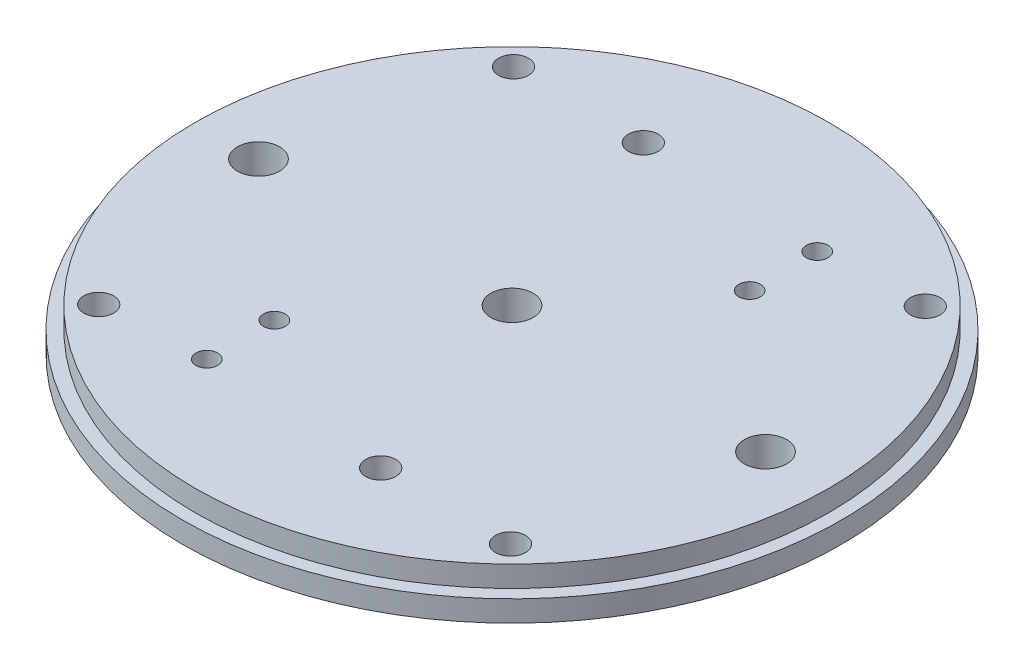
ISO-10303-21;
HEADER;
FILE_DESCRIPTION(('STEP AP214'),'2;1');
FILE_NAME('part.step','',(''),(''),'','','');
FILE_SCHEMA(('AUTOMOTIVE_DESIGN { 1 0 10303 214 1 1 1 1 }'));
ENDSEC;
DATA;
#1=APPLICATION_CONTEXT('core data for automotive mechanical design processes');
#2=APPLICATION_PROTOCOL_DEFINITION('international standard','automotive_design',2000,#1);
#3=PRODUCT_CONTEXT('',#1,'mechanical');
#4=PRODUCT('Part','Part','',(#3));
#5=PRODUCT_RELATED_PRODUCT_CATEGORY('part','',(#4));
#6=PRODUCT_DEFINITION_FORMATION('','',#4);
#7=PRODUCT_DEFINITION_CONTEXT('part definition',#1,'design');
#8=PRODUCT_DEFINITION('design','',#6,#7);
#9=PRODUCT_DEFINITION_SHAPE('','',#8);
#10=(LENGTH_UNIT() NAMED_UNIT(*) SI_UNIT(.MILLI.,.METRE.));
#11=(NAMED_UNIT(*) PLANE_ANGLE_UNIT() SI_UNIT($,.RADIAN.));
#12=(NAMED_UNIT(*) SI_UNIT($,.STERADIAN.) SOLID_ANGLE_UNIT());
#13=UNCERTAINTY_MEASURE_WITH_UNIT(LENGTH_MEASURE(1.E-05),#10,'distance_accuracy_value','');
#14=(GEOMETRIC_REPRESENTATION_CONTEXT(3) GLOBAL_UNCERTAINTY_ASSIGNED_CONTEXT((#13)) GLOBAL_UNIT_ASSIGNED_CONTEXT((#10,
#11,#12)) REPRESENTATION_CONTEXT('',''));
#15=CARTESIAN_POINT('',(0.,0.,0.));
#16=DIRECTION('',(0.,0.,1.));
#17=DIRECTION('',(1.,0.,0.));
#18=AXIS2_PLACEMENT_3D('',#15,#16,#17);
#19=CARTESIAN_POINT('',(0.,6.35,0.));
#20=DIRECTION('',(0.,1.,0.));
#21=DIRECTION('',(0.,0.,1.));
#22=AXIS2_PLACEMENT_3D('',#19,#20,#21);
#23=PLANE('',#22);
#24=CARTESIAN_POINT('',(0.,6.35,0.));
#25=DIRECTION('',(0.,1.,0.));
#26=DIRECTION('',(0.,0.,1.));
#27=AXIS2_PLACEMENT_3D('',#24,#25,#26);
#28=CIRCLE('',#27,47.625);
#29=CARTESIAN_POINT('',(0.,6.35,47.625));
#30=VERTEX_POINT('',#29);
#31=EDGE_CURVE('E42',#30,#30,#28,.T.);
#32=ORIENTED_EDGE('',*,*,#31,.T.);
#33=EDGE_LOOP('',(#32));
#34=FACE_BOUND('',#33,.T.);
#35=CARTESIAN_POINT('',(-38.1,6.35,0.));
#36=DIRECTION('',(0.,1.,0.));
#37=DIRECTION('',(0.,0.,1.));
#38=AXIS2_PLACEMENT_3D('',#35,#36,#37);
#39=CIRCLE('',#38,3.175);
#40=CARTESIAN_POINT('',(-38.1,6.35,3.175));
#41=VERTEX_POINT('',#40);
#42=EDGE_CURVE('E50',#41,#41,#39,.T.);
#43=ORIENTED_EDGE('',*,*,#42,.F.);
#44=EDGE_LOOP('',(#43));
#45=FACE_BOUND('',#44,.T.);
#46=CARTESIAN_POINT('',(38.1,6.35,0.));
#47=DIRECTION('',(0.,1.,0.));
#48=DIRECTION('',(0.,0.,1.));
#49=AXIS2_PLACEMENT_3D('',#46,#47,#48);
#50=CIRCLE('',#49,3.175);
#51=CARTESIAN_POINT('',(38.1,6.35,3.175));
#52=VERTEX_POINT('',#51);
#53=EDGE_CURVE('E56',#52,#52,#50,.T.);
#54=ORIENTED_EDGE('',*,*,#53,.F.);
#55=EDGE_LOOP('',(#54));
#56=FACE_BOUND('',#55,.T.);
#57=CARTESIAN_POINT('',(0.,6.35,0.));
#58=DIRECTION('',(0.,1.,0.));
#59=DIRECTION('',(0.,0.,1.));
#60=AXIS2_PLACEMENT_3D('',#57,#58,#59);
#61=CIRCLE('',#60,3.175);
#62=CARTESIAN_POINT('',(0.,6.35,3.175));
#63=VERTEX_POINT('',#62);
#64=EDGE_CURVE('E62',#63,#63,#61,.T.);
#65=ORIENTED_EDGE('',*,*,#64,.F.);
#66=EDGE_LOOP('',(#65));
#67=FACE_BOUND('',#66,.T.);
#68=CARTESIAN_POINT('',(-31.1697748135231,6.35,30.940594365611));
#69=DIRECTION('',(0.,-1.,0.));
#70=DIRECTION('',(0.,0.,-1.));
#71=AXIS2_PLACEMENT_3D('',#68,#69,#70);
#72=CIRCLE('',#71,2.2479);
#73=CARTESIAN_POINT('',(-31.1697748135231,6.35,28.692694365611));
#74=VERTEX_POINT('',#73);
#75=EDGE_CURVE('E65',#74,#74,#72,.T.);
#76=ORIENTED_EDGE('',*,*,#75,.T.);
#77=EDGE_LOOP('',(#76));
#78=FACE_BOUND('',#77,.T.);
#79=CARTESIAN_POINT('',(30.9405943656111,6.35,31.169774813523));
#80=DIRECTION('',(0.,-1.,0.));
#81=DIRECTION('',(0.,0.,-1.));
#82=AXIS2_PLACEMENT_3D('',#79,#80,#81);
#83=CIRCLE('',#82,2.24789999999999);
#84=CARTESIAN_POINT('',(30.9405943656111,6.35,28.921874813523));
#85=VERTEX_POINT('',#84);
#86=EDGE_CURVE('E76',#85,#85,#83,.T.);
#87=ORIENTED_EDGE('',*,*,#86,.T.);
#88=EDGE_LOOP('',(#87));
#89=FACE_BOUND('',#88,.T.);
#90=CARTESIAN_POINT('',(31.1697748135231,6.35,-30.940594365611));
#91=DIRECTION('',(0.,-1.,0.));
#92=DIRECTION('',(0.,0.,-1.));
#93=AXIS2_PLACEMENT_3D('',#90,#91,#92);
#94=CIRCLE('',#93,2.2479);
#95=CARTESIAN_POINT('',(31.1697748135231,6.35,-33.188494365611));
#96=VERTEX_POINT('',#95);
#97=EDGE_CURVE('E85',#96,#96,#94,.T.);
#98=ORIENTED_EDGE('',*,*,#97,.T.);
#99=EDGE_LOOP('',(#98));
#100=FACE_BOUND('',#99,.T.);
#101=CARTESIAN_POINT('',(-30.9405943656113,6.35,-31.1697748135227));
#102=DIRECTION('',(0.,-1.,0.));
#103=DIRECTION('',(0.,0.,-1.));
#104=AXIS2_PLACEMENT_3D('',#101,#102,#103);
#105=CIRCLE('',#104,2.2479);
#106=CARTESIAN_POINT('',(-30.9405943656113,6.35,-33.4176748135227));
#107=VERTEX_POINT('',#106);
#108=EDGE_CURVE('E94',#107,#107,#105,.T.);
#109=ORIENTED_EDGE('',*,*,#108,.T.);
#110=EDGE_LOOP('',(#109));
#111=FACE_BOUND('',#110,.T.);
#112=CARTESIAN_POINT('',(11.2935051326137,6.35,31.0286503383506));
#113=DIRECTION('',(0.,-1.,0.));
#114=DIRECTION('',(0.,0.,-1.));
#115=AXIS2_PLACEMENT_3D('',#112,#113,#114);
#116=CIRCLE('',#115,2.2479);
#117=CARTESIAN_POINT('',(11.2935051326137,6.35,28.7807503383506));
#118=VERTEX_POINT('',#117);
#119=EDGE_CURVE('E103',#118,#118,#116,.T.);
#120=ORIENTED_EDGE('',*,*,#119,.T.);
#121=EDGE_LOOP('',(#120));
#122=FACE_BOUND('',#121,.T.);
#123=CARTESIAN_POINT('',(-11.2935051326137,6.35,-31.0286503383507));
#124=DIRECTION('',(0.,-1.,0.));
#125=DIRECTION('',(0.,0.,-1.));
#126=AXIS2_PLACEMENT_3D('',#123,#124,#125);
#127=CIRCLE('',#126,2.2479);
#128=CARTESIAN_POINT('',(-11.2935051326137,6.35,-33.2765503383507));
#129=VERTEX_POINT('',#128);
#130=EDGE_CURVE('E109',#129,#129,#127,.T.);
#131=ORIENTED_EDGE('',*,*,#130,.T.);
#132=EDGE_LOOP('',(#131));
#133=FACE_BOUND('',#132,.T.);
#134=CARTESIAN_POINT('',(-15.9297748135231,6.34999999999999,29.9438892635004));
#135=DIRECTION('',(0.,-1.,0.));
#136=DIRECTION('',(0.,0.,-1.));
#137=AXIS2_PLACEMENT_3D('',#134,#135,#136);
#138=CIRCLE('',#137,1.63194999999999);
#139=CARTESIAN_POINT('',(-15.9297748135231,6.34999999999999,28.3119392635004));
#140=VERTEX_POINT('',#139);
#141=EDGE_CURVE('E115',#140,#140,#138,.T.);
#142=ORIENTED_EDGE('',*,*,#141,.T.);
#143=EDGE_LOOP('',(#142));
#144=FACE_BOUND('',#143,.T.);
#145=CARTESIAN_POINT('',(15.9297748135231,6.34999999999999,-29.9438892635004));
#146=DIRECTION('',(0.,-1.,0.));
#147=DIRECTION('',(0.,0.,-1.));
#148=AXIS2_PLACEMENT_3D('',#145,#146,#147);
#149=CIRCLE('',#148,1.63194999999999);
#150=CARTESIAN_POINT('',(15.9297748135231,6.34999999999999,-31.5758392635004));
#151=VERTEX_POINT('',#150);
#152=EDGE_CURVE('E121',#151,#151,#149,.T.);
#153=ORIENTED_EDGE('',*,*,#152,.T.);
#154=EDGE_LOOP('',(#153));
#155=FACE_BOUND('',#154,.T.);
#156=CARTESIAN_POINT('',(-15.9297748135231,6.34999999999999,19.7838892635004));
#157=DIRECTION('',(0.,-1.,0.));
#158=DIRECTION('',(0.,0.,-1.));
#159=AXIS2_PLACEMENT_3D('',#156,#157,#158);
#160=CIRCLE('',#159,1.63194999999999);
#161=CARTESIAN_POINT('',(-15.9297748135231,6.34999999999999,18.1519392635004));
#162=VERTEX_POINT('',#161);
#163=EDGE_CURVE('E127',#162,#162,#160,.T.);
#164=ORIENTED_EDGE('',*,*,#163,.T.);
#165=EDGE_LOOP('',(#164));
#166=FACE_BOUND('',#165,.T.);
#167=CARTESIAN_POINT('',(15.9297748135231,6.34999999999999,-19.7838892635004));
#168=DIRECTION('',(0.,-1.,0.));
#169=DIRECTION('',(0.,0.,-1.));
#170=AXIS2_PLACEMENT_3D('',#167,#168,#169);
#171=CIRCLE('',#170,1.63194999999999);
#172=CARTESIAN_POINT('',(15.9297748135231,6.34999999999999,-21.4158392635004));
#173=VERTEX_POINT('',#172);
#174=EDGE_CURVE('E133',#173,#173,#171,.T.);
#175=ORIENTED_EDGE('',*,*,#174,.T.);
#176=EDGE_LOOP('',(#175));
#177=FACE_BOUND('',#176,.T.);
#178=ADVANCED_FACE('F31',(#34,#45,#56,#67,#78,#89,#100,#111,#122,#133,#144,#155,#166,#177),#23,.T.);
#179=CARTESIAN_POINT('',(0.,0.,0.));
#180=DIRECTION('',(0.,1.,0.));
#181=DIRECTION('',(0.,0.,1.));
#182=AXIS2_PLACEMENT_3D('',#179,#180,#181);
#183=PLANE('',#182);
#184=CARTESIAN_POINT('',(15.9297748135231,0.,-19.7838892635004));
#185=DIRECTION('',(0.,-1.,0.));
#186=DIRECTION('',(0.,0.,-1.));
#187=AXIS2_PLACEMENT_3D('',#184,#185,#186);
#188=CIRCLE('',#187,1.63194999999999);
#189=CARTESIAN_POINT('',(15.9297748135231,0.,-21.4158392635004));
#190=VERTEX_POINT('',#189);
#191=EDGE_CURVE('E136',#190,#190,#188,.T.);
#192=ORIENTED_EDGE('',*,*,#191,.F.);
#193=EDGE_LOOP('',(#192));
#194=FACE_BOUND('',#193,.T.);
#195=CARTESIAN_POINT('',(-15.9297748135231,0.,19.7838892635004));
#196=DIRECTION('',(0.,-1.,0.));
#197=DIRECTION('',(0.,0.,-1.));
#198=AXIS2_PLACEMENT_3D('',#195,#196,#197);
#199=CIRCLE('',#198,1.63194999999999);
#200=CARTESIAN_POINT('',(-15.9297748135231,0.,18.1519392635004));
#201=VERTEX_POINT('',#200);
#202=EDGE_CURVE('E130',#201,#201,#199,.T.);
#203=ORIENTED_EDGE('',*,*,#202,.F.);
#204=EDGE_LOOP('',(#203));
#205=FACE_BOUND('',#204,.T.);
#206=CARTESIAN_POINT('',(15.9297748135231,0.,-29.9438892635004));
#207=DIRECTION('',(0.,-1.,0.));
#208=DIRECTION('',(0.,0.,-1.));
#209=AXIS2_PLACEMENT_3D('',#206,#207,#208);
#210=CIRCLE('',#209,1.63194999999999);
#211=CARTESIAN_POINT('',(15.9297748135231,0.,-31.5758392635004));
#212=VERTEX_POINT('',#211);
#213=EDGE_CURVE('E124',#212,#212,#210,.T.);
#214=ORIENTED_EDGE('',*,*,#213,.F.);
#215=EDGE_LOOP('',(#214));
#216=FACE_BOUND('',#215,.T.);
#217=CARTESIAN_POINT('',(-15.9297748135231,0.,29.9438892635004));
#218=DIRECTION('',(0.,-1.,0.));
#219=DIRECTION('',(0.,0.,-1.));
#220=AXIS2_PLACEMENT_3D('',#217,#218,#219);
#221=CIRCLE('',#220,1.63194999999999);
#222=CARTESIAN_POINT('',(-15.9297748135231,0.,28.3119392635004));
#223=VERTEX_POINT('',#222);
#224=EDGE_CURVE('E118',#223,#223,#221,.T.);
#225=ORIENTED_EDGE('',*,*,#224,.F.);
#226=EDGE_LOOP('',(#225));
#227=FACE_BOUND('',#226,.T.);
#228=CARTESIAN_POINT('',(-30.9405943656113,0.,-31.1697748135227));
#229=DIRECTION('',(0.,-1.,0.));
#230=DIRECTION('',(0.,0.,-1.));
#231=AXIS2_PLACEMENT_3D('',#228,#229,#230);
#232=CIRCLE('',#231,4.2164);
#233=CARTESIAN_POINT('',(-30.9405943656113,0.,-35.3861748135228));
#234=VERTEX_POINT('',#233);
#235=EDGE_CURVE('E100',#234,#234,#232,.T.);
#236=ORIENTED_EDGE('',*,*,#235,.F.);
#237=EDGE_LOOP('',(#236));
#238=FACE_BOUND('',#237,.T.);
#239=CARTESIAN_POINT('',(31.1697748135231,0.,-30.940594365611));
#240=DIRECTION('',(0.,-1.,0.));
#241=DIRECTION('',(0.,0.,-1.));
#242=AXIS2_PLACEMENT_3D('',#239,#240,#241);
#243=CIRCLE('',#242,4.2164);
#244=CARTESIAN_POINT('',(31.1697748135231,0.,-35.156994365611));
#245=VERTEX_POINT('',#244);
#246=EDGE_CURVE('E91',#245,#245,#243,.T.);
#247=ORIENTED_EDGE('',*,*,#246,.F.);
#248=EDGE_LOOP('',(#247));
#249=FACE_BOUND('',#248,.T.);
#250=CARTESIAN_POINT('',(30.9405943656111,0.,31.169774813523));
#251=DIRECTION('',(0.,-1.,0.));
#252=DIRECTION('',(0.,0.,-1.));
#253=AXIS2_PLACEMENT_3D('',#250,#251,#252);
#254=CIRCLE('',#253,4.2164);
#255=CARTESIAN_POINT('',(30.9405943656111,0.,26.953374813523));
#256=VERTEX_POINT('',#255);
#257=EDGE_CURVE('E82',#256,#256,#254,.T.);
#258=ORIENTED_EDGE('',*,*,#257,.F.);
#259=EDGE_LOOP('',(#258));
#260=FACE_BOUND('',#259,.T.);
#261=CARTESIAN_POINT('',(-31.1697748135231,0.,30.940594365611));
#262=DIRECTION('',(0.,-1.,0.));
#263=DIRECTION('',(0.,0.,-1.));
#264=AXIS2_PLACEMENT_3D('',#261,#262,#263);
#265=CIRCLE('',#264,4.2164);
#266=CARTESIAN_POINT('',(-31.1697748135231,0.,26.724194365611));
#267=VERTEX_POINT('',#266);
#268=EDGE_CURVE('E73',#267,#267,#265,.T.);
#269=ORIENTED_EDGE('',*,*,#268,.F.);
#270=EDGE_LOOP('',(#269));
#271=FACE_BOUND('',#270,.T.);
#272=CARTESIAN_POINT('',(0.,0.,0.));
#273=DIRECTION('',(0.,1.,0.));
#274=DIRECTION('',(0.,0.,1.));
#275=AXIS2_PLACEMENT_3D('',#272,#273,#274);
#276=CIRCLE('',#275,3.175);
#277=CARTESIAN_POINT('',(0.,0.,3.175));
#278=VERTEX_POINT('',#277);
#279=EDGE_CURVE('E59',#278,#278,#276,.T.);
#280=ORIENTED_EDGE('',*,*,#279,.T.);
#281=EDGE_LOOP('',(#280));
#282=FACE_BOUND('',#281,.T.);
#283=CARTESIAN_POINT('',(38.1,0.,0.));
#284=DIRECTION('',(0.,1.,0.));
#285=DIRECTION('',(0.,0.,1.));
#286=AXIS2_PLACEMENT_3D('',#283,#284,#285);
#287=CIRCLE('',#286,3.175);
#288=CARTESIAN_POINT('',(38.1,0.,3.175));
#289=VERTEX_POINT('',#288);
#290=EDGE_CURVE('E53',#289,#289,#287,.T.);
#291=ORIENTED_EDGE('',*,*,#290,.T.);
#292=EDGE_LOOP('',(#291));
#293=FACE_BOUND('',#292,.T.);
#294=CARTESIAN_POINT('',(-38.1,0.,0.));
#295=DIRECTION('',(0.,1.,0.));
#296=DIRECTION('',(0.,0.,1.));
#297=AXIS2_PLACEMENT_3D('',#294,#295,#296);
#298=CIRCLE('',#297,3.175);
#299=CARTESIAN_POINT('',(-38.1,0.,3.175));
#300=VERTEX_POINT('',#299);
#301=EDGE_CURVE('E47',#300,#300,#298,.T.);
#302=ORIENTED_EDGE('',*,*,#301,.T.);
#303=EDGE_LOOP('',(#302));
#304=FACE_BOUND('',#303,.T.);
#305=CARTESIAN_POINT('',(0.,0.,0.));
#306=DIRECTION('',(0.,1.,0.));
#307=DIRECTION('',(0.,0.,1.));
#308=AXIS2_PLACEMENT_3D('',#305,#306,#307);
#309=CIRCLE('',#308,49.53);
#310=CARTESIAN_POINT('',(0.,0.,49.53));
#311=VERTEX_POINT('',#310);
#312=EDGE_CURVE('E35',#311,#311,#309,.T.);
#313=ORIENTED_EDGE('',*,*,#312,.F.);
#314=EDGE_LOOP('',(#313));
#315=FACE_BOUND('',#314,.T.);
#316=CARTESIAN_POINT('',(11.2935051326137,0.,31.0286503383506));
#317=DIRECTION('',(0.,-1.,0.));
#318=DIRECTION('',(0.,0.,-1.));
#319=AXIS2_PLACEMENT_3D('',#316,#317,#318);
#320=CIRCLE('',#319,2.2479);
#321=CARTESIAN_POINT('',(11.2935051326137,0.,28.7807503383506));
#322=VERTEX_POINT('',#321);
#323=EDGE_CURVE('E106',#322,#322,#320,.T.);
#324=ORIENTED_EDGE('',*,*,#323,.F.);
#325=EDGE_LOOP('',(#324));
#326=FACE_BOUND('',#325,.T.);
#327=CARTESIAN_POINT('',(-11.2935051326137,0.,-31.0286503383507));
#328=DIRECTION('',(0.,-1.,0.));
#329=DIRECTION('',(0.,0.,-1.));
#330=AXIS2_PLACEMENT_3D('',#327,#328,#329);
#331=CIRCLE('',#330,2.2479);
#332=CARTESIAN_POINT('',(-11.2935051326137,0.,-33.2765503383507));
#333=VERTEX_POINT('',#332);
#334=EDGE_CURVE('E112',#333,#333,#331,.T.);
#335=ORIENTED_EDGE('',*,*,#334,.F.);
#336=EDGE_LOOP('',(#335));
#337=FACE_BOUND('',#336,.T.);
#338=ADVANCED_FACE('F142',(#194,#205,#216,#227,#238,#249,#260,#271,#282,#293,#304,#315,#326,
#337),#183,.F.);
#339=CARTESIAN_POINT('',(0.,3.175,0.));
#340=DIRECTION('',(0.,1.,0.));
#341=DIRECTION('',(0.,0.,1.));
#342=AXIS2_PLACEMENT_3D('',#339,#340,#341);
#343=PLANE('',#342);
#344=CARTESIAN_POINT('',(0.,3.175,0.));
#345=DIRECTION('',(0.,1.,0.));
#346=DIRECTION('',(0.,0.,1.));
#347=AXIS2_PLACEMENT_3D('',#344,#345,#346);
#348=CIRCLE('',#347,49.53);
#349=CARTESIAN_POINT('',(0.,3.175,49.53));
#350=VERTEX_POINT('',#349);
#351=EDGE_CURVE('E10',#350,#350,#348,.T.);
#352=ORIENTED_EDGE('',*,*,#351,.T.);
#353=EDGE_LOOP('',(#352));
#354=FACE_BOUND('',#353,.T.);
#355=CARTESIAN_POINT('',(0.,3.175,0.));
#356=DIRECTION('',(0.,1.,0.));
#357=DIRECTION('',(0.,0.,1.));
#358=AXIS2_PLACEMENT_3D('',#355,#356,#357);
#359=CIRCLE('',#358,47.625);
#360=CARTESIAN_POINT('',(0.,3.175,47.625));
#361=VERTEX_POINT('',#360);
#362=EDGE_CURVE('E44',#361,#361,#359,.T.);
#363=ORIENTED_EDGE('',*,*,#362,.F.);
#364=EDGE_LOOP('',(#363));
#365=FACE_BOUND('',#364,.T.);
#366=ADVANCED_FACE('F145',(#354,#365),#343,.T.);
#367=CARTESIAN_POINT('',(0.,3.175,0.));
#368=DIRECTION('',(0.,-1.,0.));
#369=DIRECTION('',(0.,0.,-1.));
#370=AXIS2_PLACEMENT_3D('',#367,#368,#369);
#371=CYLINDRICAL_SURFACE('',#370,49.53);
#372=ORIENTED_EDGE('',*,*,#351,.F.);
#373=EDGE_LOOP('',(#372));
#374=FACE_BOUND('',#373,.T.);
#375=ORIENTED_EDGE('',*,*,#312,.T.);
#376=EDGE_LOOP('',(#375));
#377=FACE_BOUND('',#376,.T.);
#378=ADVANCED_FACE('F33',(#374,#377),#371,.T.);
#379=CARTESIAN_POINT('',(0.,6.35,0.));
#380=DIRECTION('',(0.,-1.,0.));
#381=DIRECTION('',(0.,0.,-1.));
#382=AXIS2_PLACEMENT_3D('',#379,#380,#381);
#383=CYLINDRICAL_SURFACE('',#382,47.625);
#384=ORIENTED_EDGE('',*,*,#31,.F.);
#385=EDGE_LOOP('',(#384));
#386=FACE_BOUND('',#385,.T.);
#387=ORIENTED_EDGE('',*,*,#362,.T.);
#388=EDGE_LOOP('',(#387));
#389=FACE_BOUND('',#388,.T.);
#390=ADVANCED_FACE('F199',(#386,#389),#383,.T.);
#391=CARTESIAN_POINT('',(-38.1,0.,0.));
#392=DIRECTION('',(0.,1.,0.));
#393=DIRECTION('',(0.,0.,1.));
#394=AXIS2_PLACEMENT_3D('',#391,#392,#393);
#395=CYLINDRICAL_SURFACE('',#394,3.175);
#396=ORIENTED_EDGE('',*,*,#301,.F.);
#397=EDGE_LOOP('',(#396));
#398=FACE_BOUND('',#397,.T.);
#399=ORIENTED_EDGE('',*,*,#42,.T.);
#400=EDGE_LOOP('',(#399));
#401=FACE_BOUND('',#400,.T.);
#402=ADVANCED_FACE('F197',(#398,#401),#395,.F.);
#403=CARTESIAN_POINT('',(38.1,0.,0.));
#404=DIRECTION('',(0.,1.,0.));
#405=DIRECTION('',(0.,0.,1.));
#406=AXIS2_PLACEMENT_3D('',#403,#404,#405);
#407=CYLINDRICAL_SURFACE('',#406,3.175);
#408=ORIENTED_EDGE('',*,*,#290,.F.);
#409=EDGE_LOOP('',(#408));
#410=FACE_BOUND('',#409,.T.);
#411=ORIENTED_EDGE('',*,*,#53,.T.);
#412=EDGE_LOOP('',(#411));
#413=FACE_BOUND('',#412,.T.);
#414=ADVANCED_FACE('F224',(#410,#413),#407,.F.);
#415=CARTESIAN_POINT('',(0.,0.,0.));
#416=DIRECTION('',(0.,1.,0.));
#417=DIRECTION('',(0.,0.,1.));
#418=AXIS2_PLACEMENT_3D('',#415,#416,#417);
#419=CYLINDRICAL_SURFACE('',#418,3.175);
#420=ORIENTED_EDGE('',*,*,#279,.F.);
#421=EDGE_LOOP('',(#420));
#422=FACE_BOUND('',#421,.T.);
#423=ORIENTED_EDGE('',*,*,#64,.T.);
#424=EDGE_LOOP('',(#423));
#425=FACE_BOUND('',#424,.T.);
#426=ADVANCED_FACE('F231',(#422,#425),#419,.F.);
#427=CARTESIAN_POINT('',(-31.1697748135231,0.,30.940594365611));
#428=DIRECTION('',(0.,-1.,0.));
#429=DIRECTION('',(0.,0.,-1.));
#430=AXIS2_PLACEMENT_3D('',#427,#428,#429);
#431=CYLINDRICAL_SURFACE('',#430,2.24789999999999);
#432=ORIENTED_EDGE('',*,*,#75,.F.);
#433=EDGE_LOOP('',(#432));
#434=FACE_BOUND('',#433,.T.);
#435=CARTESIAN_POINT('',(-31.1697748135231,2.26450020961459,30.940594365611));
#436=DIRECTION('',(0.,-1.,0.));
#437=DIRECTION('',(0.,0.,-1.));
#438=AXIS2_PLACEMENT_3D('',#435,#436,#437);
#439=CIRCLE('',#438,2.24789999999999);
#440=CARTESIAN_POINT('',(-31.1697748135231,2.26450020961459,28.692694365611));
#441=VERTEX_POINT('',#440);
#442=EDGE_CURVE('E70',#441,#441,#439,.T.);
#443=ORIENTED_EDGE('',*,*,#442,.T.);
#444=EDGE_LOOP('',(#443));
#445=FACE_BOUND('',#444,.T.);
#446=ADVANCED_FACE('F238',(#434,#445),#431,.F.);
#447=CARTESIAN_POINT('',(-31.1697748135231,0.,30.940594365611));
#448=DIRECTION('',(0.,-1.,0.));
#449=DIRECTION('',(0.,0.,-1.));
#450=AXIS2_PLACEMENT_3D('',#447,#448,#449);
#451=CONICAL_SURFACE('',#450,4.2164,0.715584993317671);
#452=ORIENTED_EDGE('',*,*,#442,.F.);
#453=EDGE_LOOP('',(#452));
#454=FACE_BOUND('',#453,.T.);
#455=ORIENTED_EDGE('',*,*,#268,.T.);
#456=EDGE_LOOP('',(#455));
#457=FACE_BOUND('',#456,.T.);
#458=ADVANCED_FACE('F246',(#454,#457),#451,.F.);
#459=CARTESIAN_POINT('',(30.9405943656111,0.,31.169774813523));
#460=DIRECTION('',(0.,-1.,0.));
#461=DIRECTION('',(0.,0.,-1.));
#462=AXIS2_PLACEMENT_3D('',#459,#460,#461);
#463=CYLINDRICAL_SURFACE('',#462,2.24789999999999);
#464=ORIENTED_EDGE('',*,*,#86,.F.);
#465=EDGE_LOOP('',(#464));
#466=FACE_BOUND('',#465,.T.);
#467=CARTESIAN_POINT('',(30.9405943656111,2.26450020961459,31.169774813523));
#468=DIRECTION('',(0.,-1.,0.));
#469=DIRECTION('',(0.,0.,-1.));
#470=AXIS2_PLACEMENT_3D('',#467,#468,#469);
#471=CIRCLE('',#470,2.24789999999999);
#472=CARTESIAN_POINT('',(30.9405943656111,2.26450020961459,28.921874813523));
#473=VERTEX_POINT('',#472);
#474=EDGE_CURVE('E79',#473,#473,#471,.T.);
#475=ORIENTED_EDGE('',*,*,#474,.T.);
#476=EDGE_LOOP('',(#475));
#477=FACE_BOUND('',#476,.T.);
#478=ADVANCED_FACE('F254',(#466,#477),#463,.F.);
#479=CARTESIAN_POINT('',(30.9405943656111,0.,31.169774813523));
#480=DIRECTION('',(0.,-1.,0.));
#481=DIRECTION('',(0.,0.,-1.));
#482=AXIS2_PLACEMENT_3D('',#479,#480,#481);
#483=CONICAL_SURFACE('',#482,4.2164,0.71558499331767);
#484=ORIENTED_EDGE('',*,*,#474,.F.);
#485=EDGE_LOOP('',(#484));
#486=FACE_BOUND('',#485,.T.);
#487=ORIENTED_EDGE('',*,*,#257,.T.);
#488=EDGE_LOOP('',(#487));
#489=FACE_BOUND('',#488,.T.);
#490=ADVANCED_FACE('F262',(#486,#489),#483,.F.);
#491=CARTESIAN_POINT('',(31.1697748135231,0.,-30.940594365611));
#492=DIRECTION('',(0.,-1.,0.));
#493=DIRECTION('',(0.,0.,-1.));
#494=AXIS2_PLACEMENT_3D('',#491,#492,#493);
#495=CYLINDRICAL_SURFACE('',#494,2.24789999999999);
#496=ORIENTED_EDGE('',*,*,#97,.F.);
#497=EDGE_LOOP('',(#496));
#498=FACE_BOUND('',#497,.T.);
#499=CARTESIAN_POINT('',(31.1697748135231,2.26450020961459,-30.940594365611));
#500=DIRECTION('',(0.,-1.,0.));
#501=DIRECTION('',(0.,0.,-1.));
#502=AXIS2_PLACEMENT_3D('',#499,#500,#501);
#503=CIRCLE('',#502,2.24789999999999);
#504=CARTESIAN_POINT('',(31.1697748135231,2.26450020961459,-33.188494365611));
#505=VERTEX_POINT('',#504);
#506=EDGE_CURVE('E88',#505,#505,#503,.T.);
#507=ORIENTED_EDGE('',*,*,#506,.T.);
#508=EDGE_LOOP('',(#507));
#509=FACE_BOUND('',#508,.T.);
#510=ADVANCED_FACE('F270',(#498,#509),#495,.F.);
#511=CARTESIAN_POINT('',(31.1697748135231,0.,-30.940594365611));
#512=DIRECTION('',(0.,-1.,0.));
#513=DIRECTION('',(0.,0.,-1.));
#514=AXIS2_PLACEMENT_3D('',#511,#512,#513);
#515=CONICAL_SURFACE('',#514,4.2164,0.71558499331767);
#516=ORIENTED_EDGE('',*,*,#506,.F.);
#517=EDGE_LOOP('',(#516));
#518=FACE_BOUND('',#517,.T.);
#519=ORIENTED_EDGE('',*,*,#246,.T.);
#520=EDGE_LOOP('',(#519));
#521=FACE_BOUND('',#520,.T.);
#522=ADVANCED_FACE('F278',(#518,#521),#515,.F.);
#523=CARTESIAN_POINT('',(-30.9405943656113,0.,-31.1697748135227));
#524=DIRECTION('',(0.,-1.,0.));
#525=DIRECTION('',(0.,0.,-1.));
#526=AXIS2_PLACEMENT_3D('',#523,#524,#525);
#527=CYLINDRICAL_SURFACE('',#526,2.24789999999999);
#528=ORIENTED_EDGE('',*,*,#108,.F.);
#529=EDGE_LOOP('',(#528));
#530=FACE_BOUND('',#529,.T.);
#531=CARTESIAN_POINT('',(-30.9405943656113,2.26450020961459,-31.1697748135227));
#532=DIRECTION('',(0.,-1.,0.));
#533=DIRECTION('',(0.,0.,-1.));
#534=AXIS2_PLACEMENT_3D('',#531,#532,#533);
#535=CIRCLE('',#534,2.24789999999999);
#536=CARTESIAN_POINT('',(-30.9405943656113,2.26450020961459,-33.4176748135227));
#537=VERTEX_POINT('',#536);
#538=EDGE_CURVE('E97',#537,#537,#535,.T.);
#539=ORIENTED_EDGE('',*,*,#538,.T.);
#540=EDGE_LOOP('',(#539));
#541=FACE_BOUND('',#540,.T.);
#542=ADVANCED_FACE('F286',(#530,#541),#527,.F.);
#543=CARTESIAN_POINT('',(-30.9405943656113,0.,-31.1697748135227));
#544=DIRECTION('',(0.,-1.,0.));
#545=DIRECTION('',(0.,0.,-1.));
#546=AXIS2_PLACEMENT_3D('',#543,#544,#545);
#547=CONICAL_SURFACE('',#546,4.2164,0.715584993317671);
#548=ORIENTED_EDGE('',*,*,#538,.F.);
#549=EDGE_LOOP('',(#548));
#550=FACE_BOUND('',#549,.T.);
#551=ORIENTED_EDGE('',*,*,#235,.T.);
#552=EDGE_LOOP('',(#551));
#553=FACE_BOUND('',#552,.T.);
#554=ADVANCED_FACE('F185',(#550,#553),#547,.F.);
#555=CARTESIAN_POINT('',(11.2935051326137,0.,31.0286503383506));
#556=DIRECTION('',(0.,-1.,0.));
#557=DIRECTION('',(0.,0.,-1.));
#558=AXIS2_PLACEMENT_3D('',#555,#556,#557);
#559=CYLINDRICAL_SURFACE('',#558,2.2479);
#560=ORIENTED_EDGE('',*,*,#119,.F.);
#561=EDGE_LOOP('',(#560));
#562=FACE_BOUND('',#561,.T.);
#563=ORIENTED_EDGE('',*,*,#323,.T.);
#564=EDGE_LOOP('',(#563));
#565=FACE_BOUND('',#564,.T.);
#566=ADVANCED_FACE('F175',(#562,#565),#559,.F.);
#567=CARTESIAN_POINT('',(-11.2935051326137,0.,-31.0286503383507));
#568=DIRECTION('',(0.,-1.,0.));
#569=DIRECTION('',(0.,0.,-1.));
#570=AXIS2_PLACEMENT_3D('',#567,#568,#569);
#571=CYLINDRICAL_SURFACE('',#570,2.2479);
#572=ORIENTED_EDGE('',*,*,#130,.F.);
#573=EDGE_LOOP('',(#572));
#574=FACE_BOUND('',#573,.T.);
#575=ORIENTED_EDGE('',*,*,#334,.T.);
#576=EDGE_LOOP('',(#575));
#577=FACE_BOUND('',#576,.T.);
#578=ADVANCED_FACE('F172',(#574,#577),#571,.F.);
#579=CARTESIAN_POINT('',(-15.9297748135231,0.,29.9438892635004));
#580=DIRECTION('',(0.,-1.,0.));
#581=DIRECTION('',(0.,0.,-1.));
#582=AXIS2_PLACEMENT_3D('',#579,#580,#581);
#583=CYLINDRICAL_SURFACE('',#582,1.63194999999999);
#584=ORIENTED_EDGE('',*,*,#141,.F.);
#585=EDGE_LOOP('',(#584));
#586=FACE_BOUND('',#585,.T.);
#587=ORIENTED_EDGE('',*,*,#224,.T.);
#588=EDGE_LOOP('',(#587));
#589=FACE_BOUND('',#588,.T.);
#590=ADVANCED_FACE('F174',(#586,#589),#583,.F.);
#591=CARTESIAN_POINT('',(15.9297748135231,0.,-29.9438892635004));
#592=DIRECTION('',(0.,-1.,0.));
#593=DIRECTION('',(0.,0.,-1.));
#594=AXIS2_PLACEMENT_3D('',#591,#592,#593);
#595=CYLINDRICAL_SURFACE('',#594,1.63194999999999);
#596=ORIENTED_EDGE('',*,*,#152,.F.);
#597=EDGE_LOOP('',(#596));
#598=FACE_BOUND('',#597,.T.);
#599=ORIENTED_EDGE('',*,*,#213,.T.);
#600=EDGE_LOOP('',(#599));
#601=FACE_BOUND('',#600,.T.);
#602=ADVANCED_FACE('F182',(#598,#601),#595,.F.);
#603=CARTESIAN_POINT('',(-15.9297748135231,0.,19.7838892635004));
#604=DIRECTION('',(0.,-1.,0.));
#605=DIRECTION('',(0.,0.,-1.));
#606=AXIS2_PLACEMENT_3D('',#603,#604,#605);
#607=CYLINDRICAL_SURFACE('',#606,1.63194999999999);
#608=ORIENTED_EDGE('',*,*,#163,.F.);
#609=EDGE_LOOP('',(#608));
#610=FACE_BOUND('',#609,.T.);
#611=ORIENTED_EDGE('',*,*,#202,.T.);
#612=EDGE_LOOP('',(#611));
#613=FACE_BOUND('',#612,.T.);
#614=ADVANCED_FACE('F335',(#610,#613),#607,.F.);
#615=CARTESIAN_POINT('',(15.9297748135231,0.,-19.7838892635004));
#616=DIRECTION('',(0.,-1.,0.));
#617=DIRECTION('',(0.,0.,-1.));
#618=AXIS2_PLACEMENT_3D('',#615,#616,#617);
#619=CYLINDRICAL_SURFACE('',#618,1.63194999999999);
#620=ORIENTED_EDGE('',*,*,#174,.F.);
#621=EDGE_LOOP('',(#620));
#622=FACE_BOUND('',#621,.T.);
#623=ORIENTED_EDGE('',*,*,#191,.T.);
#624=EDGE_LOOP('',(#623));
#625=FACE_BOUND('',#624,.T.);
#626=ADVANCED_FACE('F140',(#622,#625),#619,.F.);
#627=CLOSED_SHELL('',(#178,#338,#366,#378,#390,#402,#414,#426,#446,#458,#478,#490,#510,#522,
#542,#554,#566,#578,#590,#602,#614,#626));
#628=MANIFOLD_SOLID_BREP('B2',#627);
#629=ADVANCED_BREP_SHAPE_REPRESENTATION('',(#18,#628),#14);
#630=SHAPE_DEFINITION_REPRESENTATION(#9,#629);
ENDSEC;
END-ISO-10303-21;
